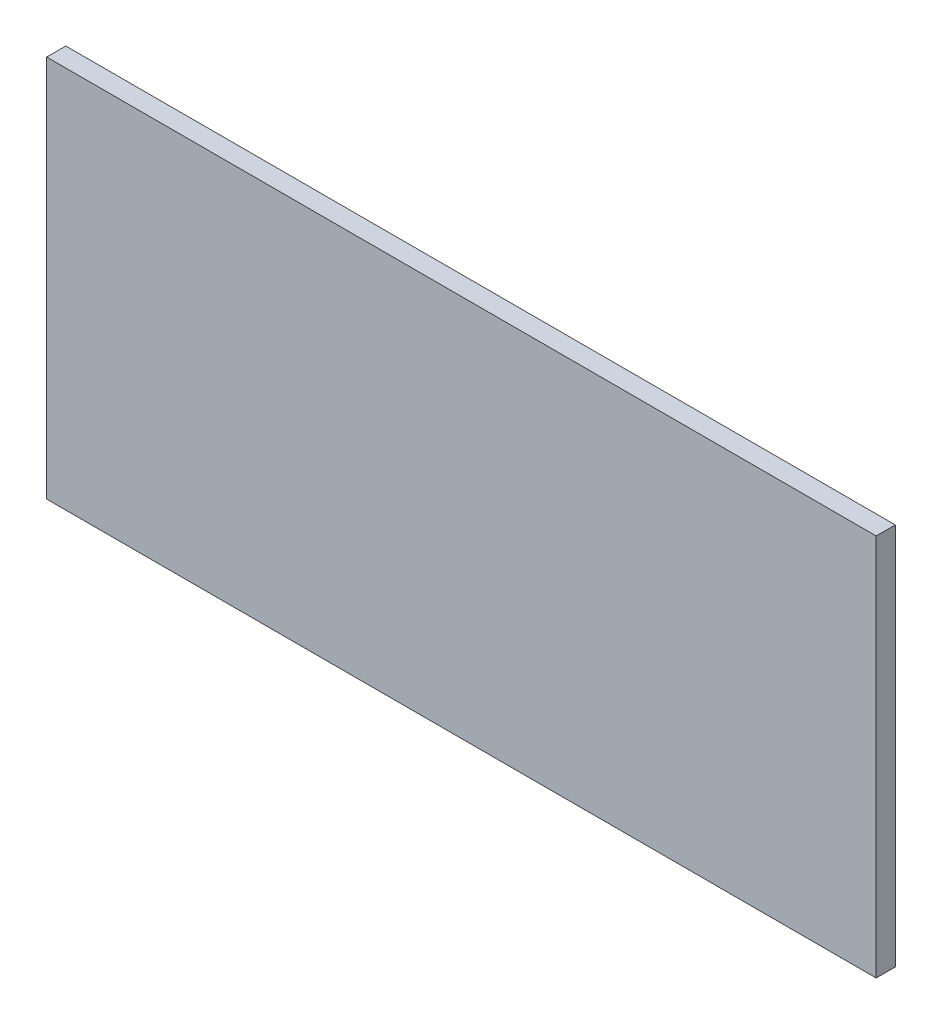
ISO-10303-21;
HEADER;
FILE_DESCRIPTION(('STEP AP214'),'2;1');
FILE_NAME('part.step','',(''),(''),'','','');
FILE_SCHEMA(('AUTOMOTIVE_DESIGN { 1 0 10303 214 1 1 1 1 }'));
ENDSEC;
DATA;
#1=APPLICATION_CONTEXT('core data for automotive mechanical design processes');
#2=APPLICATION_PROTOCOL_DEFINITION('international standard','automotive_design',2000,#1);
#3=PRODUCT_CONTEXT('',#1,'mechanical');
#4=PRODUCT('Part','Part','',(#3));
#5=PRODUCT_RELATED_PRODUCT_CATEGORY('part','',(#4));
#6=PRODUCT_DEFINITION_FORMATION('','',#4);
#7=PRODUCT_DEFINITION_CONTEXT('part definition',#1,'design');
#8=PRODUCT_DEFINITION('design','',#6,#7);
#9=PRODUCT_DEFINITION_SHAPE('','',#8);
#10=(LENGTH_UNIT() NAMED_UNIT(*) SI_UNIT(.MILLI.,.METRE.));
#11=(NAMED_UNIT(*) PLANE_ANGLE_UNIT() SI_UNIT($,.RADIAN.));
#12=(NAMED_UNIT(*) SI_UNIT($,.STERADIAN.) SOLID_ANGLE_UNIT());
#13=UNCERTAINTY_MEASURE_WITH_UNIT(LENGTH_MEASURE(1.E-05),#10,'distance_accuracy_value','');
#14=(GEOMETRIC_REPRESENTATION_CONTEXT(3) GLOBAL_UNCERTAINTY_ASSIGNED_CONTEXT((#13)) GLOBAL_UNIT_ASSIGNED_CONTEXT((#10,
#11,#12)) REPRESENTATION_CONTEXT('',''));
#15=CARTESIAN_POINT('',(0.,0.,0.));
#16=DIRECTION('',(0.,0.,1.));
#17=DIRECTION('',(1.,0.,0.));
#18=AXIS2_PLACEMENT_3D('',#15,#16,#17);
#19=CARTESIAN_POINT('',(120.32,25.3614,-3.));
#20=DIRECTION('',(0.,0.,1.));
#21=DIRECTION('',(1.,0.,0.));
#22=AXIS2_PLACEMENT_3D('',#19,#20,#21);
#23=CYLINDRICAL_SURFACE('',#22,2.49999999999999);
#24=CARTESIAN_POINT('',(120.32,25.3614,-1.5));
#25=DIRECTION('',(0.,0.,-1.));
#26=DIRECTION('',(1.,0.,0.));
#27=AXIS2_PLACEMENT_3D('',#24,#25,#26);
#28=CIRCLE('',#27,2.49999999999999);
#29=CARTESIAN_POINT('',(120.32,27.8614,-1.5));
#30=VERTEX_POINT('',#29);
#31=CARTESIAN_POINT('',(122.82,25.3614,-1.5));
#32=VERTEX_POINT('',#31);
#33=EDGE_CURVE('E141',#30,#32,#28,.T.);
#34=ORIENTED_EDGE('',*,*,#33,.T.);
#35=DIRECTION('',(0.,0.,1.));
#36=VECTOR('',#35,1.);
#37=CARTESIAN_POINT('',(122.82,25.3614,-3.));
#38=LINE('',#37,#36);
#39=CARTESIAN_POINT('',(122.82,25.3614,-3.));
#40=VERTEX_POINT('',#39);
#41=EDGE_CURVE('E12',#40,#32,#38,.T.);
#42=ORIENTED_EDGE('',*,*,#41,.F.);
#43=CARTESIAN_POINT('',(120.32,25.3614,-3.));
#44=DIRECTION('',(0.,0.,-1.));
#45=DIRECTION('',(1.,0.,0.));
#46=AXIS2_PLACEMENT_3D('',#43,#44,#45);
#47=CIRCLE('',#46,2.49999999999999);
#48=CARTESIAN_POINT('',(120.32,27.8614,-3.));
#49=VERTEX_POINT('',#48);
#50=EDGE_CURVE('E155',#49,#40,#47,.T.);
#51=ORIENTED_EDGE('',*,*,#50,.F.);
#52=DIRECTION('',(0.,0.,1.));
#53=VECTOR('',#52,1.);
#54=CARTESIAN_POINT('',(120.32,27.8614,-3.));
#55=LINE('',#54,#53);
#56=EDGE_CURVE('E137',#49,#30,#55,.T.);
#57=ORIENTED_EDGE('',*,*,#56,.T.);
#58=EDGE_LOOP('',(#34,#42,#51,#57));
#59=FACE_BOUND('',#58,.T.);
#60=ADVANCED_FACE('F45',(#59),#23,.T.);
#61=CARTESIAN_POINT('',(122.82,11.3614,-3.));
#62=DIRECTION('',(-1.,0.,0.));
#63=DIRECTION('',(0.,0.,1.));
#64=AXIS2_PLACEMENT_3D('',#61,#62,#63);
#65=PLANE('',#64);
#66=DIRECTION('',(0.,-1.,0.));
#67=VECTOR('',#66,1.);
#68=CARTESIAN_POINT('',(122.82,11.3614,-1.5));
#69=LINE('',#68,#67);
#70=CARTESIAN_POINT('',(122.82,11.3614,-1.5));
#71=VERTEX_POINT('',#70);
#72=EDGE_CURVE('E144',#32,#71,#69,.T.);
#73=ORIENTED_EDGE('',*,*,#72,.T.);
#74=DIRECTION('',(0.,0.,1.));
#75=VECTOR('',#74,1.);
#76=CARTESIAN_POINT('',(122.82,11.3614,-3.));
#77=LINE('',#76,#75);
#78=CARTESIAN_POINT('',(122.82,11.3614,-3.));
#79=VERTEX_POINT('',#78);
#80=EDGE_CURVE('E53',#79,#71,#77,.T.);
#81=ORIENTED_EDGE('',*,*,#80,.F.);
#82=DIRECTION('',(0.,-1.,0.));
#83=VECTOR('',#82,1.);
#84=CARTESIAN_POINT('',(122.82,11.3614,-3.));
#85=LINE('',#84,#83);
#86=EDGE_CURVE('E104',#40,#79,#85,.T.);
#87=ORIENTED_EDGE('',*,*,#86,.F.);
#88=ORIENTED_EDGE('',*,*,#41,.T.);
#89=EDGE_LOOP('',(#73,#81,#87,#88));
#90=FACE_BOUND('',#89,.T.);
#91=ADVANCED_FACE('F190',(#90),#65,.F.);
#92=CARTESIAN_POINT('',(120.32,11.3614,-3.));
#93=DIRECTION('',(0.,0.,1.));
#94=DIRECTION('',(1.,0.,0.));
#95=AXIS2_PLACEMENT_3D('',#92,#93,#94);
#96=CYLINDRICAL_SURFACE('',#95,2.49999999999999);
#97=CARTESIAN_POINT('',(120.32,11.3614,-1.5));
#98=DIRECTION('',(0.,0.,-1.));
#99=DIRECTION('',(1.,0.,0.));
#100=AXIS2_PLACEMENT_3D('',#97,#98,#99);
#101=CIRCLE('',#100,2.49999999999999);
#102=CARTESIAN_POINT('',(120.32,8.86139999999998,-1.5));
#103=VERTEX_POINT('',#102);
#104=EDGE_CURVE('E146',#71,#103,#101,.T.);
#105=ORIENTED_EDGE('',*,*,#104,.T.);
#106=DIRECTION('',(0.,0.,1.));
#107=VECTOR('',#106,1.);
#108=CARTESIAN_POINT('',(120.32,8.86139999999998,-3.));
#109=LINE('',#108,#107);
#110=CARTESIAN_POINT('',(120.32,8.86139999999998,-3.));
#111=VERTEX_POINT('',#110);
#112=EDGE_CURVE('E162',#111,#103,#109,.T.);
#113=ORIENTED_EDGE('',*,*,#112,.F.);
#114=CARTESIAN_POINT('',(120.32,11.3614,-3.));
#115=DIRECTION('',(0.,0.,-1.));
#116=DIRECTION('',(1.,0.,0.));
#117=AXIS2_PLACEMENT_3D('',#114,#115,#116);
#118=CIRCLE('',#117,2.49999999999999);
#119=EDGE_CURVE('E170',#79,#111,#118,.T.);
#120=ORIENTED_EDGE('',*,*,#119,.F.);
#121=ORIENTED_EDGE('',*,*,#80,.T.);
#122=EDGE_LOOP('',(#105,#113,#120,#121));
#123=FACE_BOUND('',#122,.T.);
#124=ADVANCED_FACE('F168',(#123),#96,.T.);
#125=CARTESIAN_POINT('',(75.3200000000001,8.86139999999997,-3.));
#126=DIRECTION('',(0.,1.,0.));
#127=DIRECTION('',(0.,0.,1.));
#128=AXIS2_PLACEMENT_3D('',#125,#126,#127);
#129=PLANE('',#128);
#130=DIRECTION('',(-1.,0.,0.));
#131=VECTOR('',#130,1.);
#132=CARTESIAN_POINT('',(75.3200000000001,8.86139999999997,-1.5));
#133=LINE('',#132,#131);
#134=CARTESIAN_POINT('',(75.3200000000001,8.86139999999997,-1.5));
#135=VERTEX_POINT('',#134);
#136=EDGE_CURVE('E148',#103,#135,#133,.T.);
#137=ORIENTED_EDGE('',*,*,#136,.T.);
#138=DIRECTION('',(0.,0.,1.));
#139=VECTOR('',#138,1.);
#140=CARTESIAN_POINT('',(75.3200000000001,8.86139999999997,-3.));
#141=LINE('',#140,#139);
#142=CARTESIAN_POINT('',(75.3200000000001,8.86139999999997,-3.));
#143=VERTEX_POINT('',#142);
#144=EDGE_CURVE('E159',#143,#135,#141,.T.);
#145=ORIENTED_EDGE('',*,*,#144,.F.);
#146=DIRECTION('',(-1.,0.,0.));
#147=VECTOR('',#146,1.);
#148=CARTESIAN_POINT('',(75.3200000000001,8.86139999999997,-3.));
#149=LINE('',#148,#147);
#150=EDGE_CURVE('E182',#111,#143,#149,.T.);
#151=ORIENTED_EDGE('',*,*,#150,.F.);
#152=ORIENTED_EDGE('',*,*,#112,.T.);
#153=EDGE_LOOP('',(#137,#145,#151,#152));
#154=FACE_BOUND('',#153,.T.);
#155=ADVANCED_FACE('F178',(#154),#129,.F.);
#156=CARTESIAN_POINT('',(75.3200000000001,11.3614,-3.));
#157=DIRECTION('',(0.,0.,1.));
#158=DIRECTION('',(1.,0.,0.));
#159=AXIS2_PLACEMENT_3D('',#156,#157,#158);
#160=CYLINDRICAL_SURFACE('',#159,2.5);
#161=CARTESIAN_POINT('',(75.3200000000001,11.3614,-1.5));
#162=DIRECTION('',(0.,0.,-1.));
#163=DIRECTION('',(-1.,0.,0.));
#164=AXIS2_PLACEMENT_3D('',#161,#162,#163);
#165=CIRCLE('',#164,2.5);
#166=CARTESIAN_POINT('',(72.8200000000001,11.3614,-1.5));
#167=VERTEX_POINT('',#166);
#168=EDGE_CURVE('E150',#135,#167,#165,.T.);
#169=ORIENTED_EDGE('',*,*,#168,.T.);
#170=DIRECTION('',(0.,0.,1.));
#171=VECTOR('',#170,1.);
#172=CARTESIAN_POINT('',(72.8200000000001,11.3614,-3.));
#173=LINE('',#172,#171);
#174=CARTESIAN_POINT('',(72.8200000000001,11.3614,-3.));
#175=VERTEX_POINT('',#174);
#176=EDGE_CURVE('E132',#175,#167,#173,.T.);
#177=ORIENTED_EDGE('',*,*,#176,.F.);
#178=CARTESIAN_POINT('',(75.3200000000001,11.3614,-3.));
#179=DIRECTION('',(0.,0.,-1.));
#180=DIRECTION('',(-1.,0.,0.));
#181=AXIS2_PLACEMENT_3D('',#178,#179,#180);
#182=CIRCLE('',#181,2.5);
#183=EDGE_CURVE('E123',#143,#175,#182,.T.);
#184=ORIENTED_EDGE('',*,*,#183,.F.);
#185=ORIENTED_EDGE('',*,*,#144,.T.);
#186=EDGE_LOOP('',(#169,#177,#184,#185));
#187=FACE_BOUND('',#186,.T.);
#188=ADVANCED_FACE('F181',(#187),#160,.T.);
#189=CARTESIAN_POINT('',(72.8200000000001,25.3614,-3.));
#190=DIRECTION('',(1.,0.,0.));
#191=DIRECTION('',(0.,0.,-1.));
#192=AXIS2_PLACEMENT_3D('',#189,#190,#191);
#193=PLANE('',#192);
#194=DIRECTION('',(0.,1.,0.));
#195=VECTOR('',#194,1.);
#196=CARTESIAN_POINT('',(72.8200000000001,25.3614,-1.5));
#197=LINE('',#196,#195);
#198=CARTESIAN_POINT('',(72.8200000000001,25.3614,-1.5));
#199=VERTEX_POINT('',#198);
#200=EDGE_CURVE('E131',#167,#199,#197,.T.);
#201=ORIENTED_EDGE('',*,*,#200,.T.);
#202=DIRECTION('',(0.,0.,1.));
#203=VECTOR('',#202,1.);
#204=CARTESIAN_POINT('',(72.8200000000001,25.3614,-3.));
#205=LINE('',#204,#203);
#206=CARTESIAN_POINT('',(72.8200000000001,25.3614,-3.));
#207=VERTEX_POINT('',#206);
#208=EDGE_CURVE('E128',#207,#199,#205,.T.);
#209=ORIENTED_EDGE('',*,*,#208,.F.);
#210=DIRECTION('',(0.,1.,0.));
#211=VECTOR('',#210,1.);
#212=CARTESIAN_POINT('',(72.8200000000001,25.3614,-3.));
#213=LINE('',#212,#211);
#214=EDGE_CURVE('E117',#175,#207,#213,.T.);
#215=ORIENTED_EDGE('',*,*,#214,.F.);
#216=ORIENTED_EDGE('',*,*,#176,.T.);
#217=EDGE_LOOP('',(#201,#209,#215,#216));
#218=FACE_BOUND('',#217,.T.);
#219=ADVANCED_FACE('F129',(#218),#193,.F.);
#220=CARTESIAN_POINT('',(75.3200000000001,25.3614,-3.));
#221=DIRECTION('',(0.,0.,1.));
#222=DIRECTION('',(1.,0.,0.));
#223=AXIS2_PLACEMENT_3D('',#220,#221,#222);
#224=CYLINDRICAL_SURFACE('',#223,2.5);
#225=CARTESIAN_POINT('',(75.3200000000001,25.3614,-1.5));
#226=DIRECTION('',(0.,0.,-1.));
#227=DIRECTION('',(1.,0.,0.));
#228=AXIS2_PLACEMENT_3D('',#225,#226,#227);
#229=CIRCLE('',#228,2.5);
#230=CARTESIAN_POINT('',(75.3200000000001,27.8614,-1.5));
#231=VERTEX_POINT('',#230);
#232=EDGE_CURVE('E90',#199,#231,#229,.T.);
#233=ORIENTED_EDGE('',*,*,#232,.T.);
#234=DIRECTION('',(0.,0.,1.));
#235=VECTOR('',#234,1.);
#236=CARTESIAN_POINT('',(75.3200000000001,27.8614,-3.));
#237=LINE('',#236,#235);
#238=CARTESIAN_POINT('',(75.3200000000001,27.8614,-3.));
#239=VERTEX_POINT('',#238);
#240=EDGE_CURVE('E133',#239,#231,#237,.T.);
#241=ORIENTED_EDGE('',*,*,#240,.F.);
#242=CARTESIAN_POINT('',(75.3200000000001,25.3614,-3.));
#243=DIRECTION('',(0.,0.,-1.));
#244=DIRECTION('',(1.,0.,0.));
#245=AXIS2_PLACEMENT_3D('',#242,#243,#244);
#246=CIRCLE('',#245,2.5);
#247=EDGE_CURVE('E121',#207,#239,#246,.T.);
#248=ORIENTED_EDGE('',*,*,#247,.F.);
#249=ORIENTED_EDGE('',*,*,#208,.T.);
#250=EDGE_LOOP('',(#233,#241,#248,#249));
#251=FACE_BOUND('',#250,.T.);
#252=ADVANCED_FACE('F135',(#251),#224,.T.);
#253=CARTESIAN_POINT('',(120.32,27.8614,-3.));
#254=DIRECTION('',(0.,-1.,0.));
#255=DIRECTION('',(0.,0.,-1.));
#256=AXIS2_PLACEMENT_3D('',#253,#254,#255);
#257=PLANE('',#256);
#258=DIRECTION('',(1.,0.,0.));
#259=VECTOR('',#258,1.);
#260=CARTESIAN_POINT('',(120.32,27.8614,-1.5));
#261=LINE('',#260,#259);
#262=EDGE_CURVE('E96',#231,#30,#261,.T.);
#263=ORIENTED_EDGE('',*,*,#262,.T.);
#264=ORIENTED_EDGE('',*,*,#56,.F.);
#265=DIRECTION('',(1.,0.,0.));
#266=VECTOR('',#265,1.);
#267=CARTESIAN_POINT('',(120.32,27.8614,-3.));
#268=LINE('',#267,#266);
#269=EDGE_CURVE('E61',#239,#49,#268,.T.);
#270=ORIENTED_EDGE('',*,*,#269,.F.);
#271=ORIENTED_EDGE('',*,*,#240,.T.);
#272=EDGE_LOOP('',(#263,#264,#270,#271));
#273=FACE_BOUND('',#272,.T.);
#274=ADVANCED_FACE('F206',(#273),#257,.F.);
#275=CARTESIAN_POINT('',(120.32,25.3614,-3.));
#276=DIRECTION('',(0.,0.,1.));
#277=DIRECTION('',(1.,0.,0.));
#278=AXIS2_PLACEMENT_3D('',#275,#276,#277);
#279=PLANE('',#278);
#280=ORIENTED_EDGE('',*,*,#50,.T.);
#281=ORIENTED_EDGE('',*,*,#86,.T.);
#282=ORIENTED_EDGE('',*,*,#119,.T.);
#283=ORIENTED_EDGE('',*,*,#150,.T.);
#284=ORIENTED_EDGE('',*,*,#183,.T.);
#285=ORIENTED_EDGE('',*,*,#214,.T.);
#286=ORIENTED_EDGE('',*,*,#247,.T.);
#287=ORIENTED_EDGE('',*,*,#269,.T.);
#288=EDGE_LOOP('',(#280,#281,#282,#283,#284,#285,#286,#287));
#289=FACE_BOUND('',#288,.T.);
#290=ADVANCED_FACE('F119',(#289),#279,.F.);
#291=CARTESIAN_POINT('',(120.32,25.3614,-1.5));
#292=DIRECTION('',(0.,0.,1.));
#293=DIRECTION('',(1.,0.,0.));
#294=AXIS2_PLACEMENT_3D('',#291,#292,#293);
#295=PLANE('',#294);
#296=ORIENTED_EDGE('',*,*,#33,.F.);
#297=ORIENTED_EDGE('',*,*,#262,.F.);
#298=ORIENTED_EDGE('',*,*,#232,.F.);
#299=ORIENTED_EDGE('',*,*,#200,.F.);
#300=ORIENTED_EDGE('',*,*,#168,.F.);
#301=ORIENTED_EDGE('',*,*,#136,.F.);
#302=ORIENTED_EDGE('',*,*,#104,.F.);
#303=ORIENTED_EDGE('',*,*,#72,.F.);
#304=EDGE_LOOP('',(#296,#297,#298,#299,#300,#301,#302,#303));
#305=FACE_BOUND('',#304,.T.);
#306=ADVANCED_FACE('F174',(#305),#295,.T.);
#307=CLOSED_SHELL('',(#60,#91,#124,#155,#188,#219,#252,#274,#290,#306));
#308=MANIFOLD_SOLID_BREP('B2',#307);
#309=CARTESIAN_POINT('',(130.32,3.36139999999998,-1.5));
#310=DIRECTION('',(0.,-1.,0.));
#311=DIRECTION('',(1.,0.,0.));
#312=AXIS2_PLACEMENT_3D('',#309,#310,#311);
#313=PLANE('',#312);
#314=DIRECTION('',(1.,0.,0.));
#315=VECTOR('',#314,1.);
#316=CARTESIAN_POINT('',(130.32,3.36139999999998,0.));
#317=LINE('',#316,#315);
#318=CARTESIAN_POINT('',(65.3200000000001,3.36139999999997,0.));
#319=VERTEX_POINT('',#318);
#320=CARTESIAN_POINT('',(130.32,3.36139999999998,0.));
#321=VERTEX_POINT('',#320);
#322=EDGE_CURVE('E337',#319,#321,#317,.T.);
#323=ORIENTED_EDGE('',*,*,#322,.F.);
#324=DIRECTION('',(0.,0.,1.));
#325=VECTOR('',#324,1.);
#326=CARTESIAN_POINT('',(65.3200000000001,3.36139999999997,-1.5));
#327=LINE('',#326,#325);
#328=CARTESIAN_POINT('',(65.3200000000001,3.36139999999997,-1.5));
#329=VERTEX_POINT('',#328);
#330=EDGE_CURVE('E43',#329,#319,#327,.T.);
#331=ORIENTED_EDGE('',*,*,#330,.F.);
#332=DIRECTION('',(1.,0.,0.));
#333=VECTOR('',#332,1.);
#334=CARTESIAN_POINT('',(130.32,3.36139999999998,-1.5));
#335=LINE('',#334,#333);
#336=CARTESIAN_POINT('',(130.32,3.36139999999998,-1.5));
#337=VERTEX_POINT('',#336);
#338=EDGE_CURVE('E331',#329,#337,#335,.T.);
#339=ORIENTED_EDGE('',*,*,#338,.T.);
#340=DIRECTION('',(0.,0.,1.));
#341=VECTOR('',#340,1.);
#342=CARTESIAN_POINT('',(130.32,3.36139999999998,-1.5));
#343=LINE('',#342,#341);
#344=EDGE_CURVE('E276',#337,#321,#343,.T.);
#345=ORIENTED_EDGE('',*,*,#344,.T.);
#346=EDGE_LOOP('',(#323,#331,#339,#345));
#347=FACE_BOUND('',#346,.T.);
#348=ADVANCED_FACE('F273',(#347),#313,.T.);
#349=CARTESIAN_POINT('',(65.3200000000001,3.36139999999997,-1.5));
#350=DIRECTION('',(-1.,0.,0.));
#351=DIRECTION('',(0.,0.,1.));
#352=AXIS2_PLACEMENT_3D('',#349,#350,#351);
#353=PLANE('',#352);
#354=DIRECTION('',(0.,-1.,0.));
#355=VECTOR('',#354,1.);
#356=CARTESIAN_POINT('',(65.3200000000001,3.36139999999997,0.));
#357=LINE('',#356,#355);
#358=CARTESIAN_POINT('',(65.3200000000001,33.3614,0.));
#359=VERTEX_POINT('',#358);
#360=EDGE_CURVE('E333',#359,#319,#357,.T.);
#361=ORIENTED_EDGE('',*,*,#360,.F.);
#362=DIRECTION('',(0.,0.,1.));
#363=VECTOR('',#362,1.);
#364=CARTESIAN_POINT('',(65.3200000000001,33.3614,-1.5));
#365=LINE('',#364,#363);
#366=CARTESIAN_POINT('',(65.3200000000001,33.3614,-1.5));
#367=VERTEX_POINT('',#366);
#368=EDGE_CURVE('E282',#367,#359,#365,.T.);
#369=ORIENTED_EDGE('',*,*,#368,.F.);
#370=DIRECTION('',(0.,-1.,0.));
#371=VECTOR('',#370,1.);
#372=CARTESIAN_POINT('',(65.3200000000001,3.36139999999997,-1.5));
#373=LINE('',#372,#371);
#374=EDGE_CURVE('E328',#367,#329,#373,.T.);
#375=ORIENTED_EDGE('',*,*,#374,.T.);
#376=ORIENTED_EDGE('',*,*,#330,.T.);
#377=EDGE_LOOP('',(#361,#369,#375,#376));
#378=FACE_BOUND('',#377,.T.);
#379=ADVANCED_FACE('F347',(#378),#353,.T.);
#380=CARTESIAN_POINT('',(65.3200000000001,33.3614,-1.5));
#381=DIRECTION('',(0.,1.,0.));
#382=DIRECTION('',(0.,0.,1.));
#383=AXIS2_PLACEMENT_3D('',#380,#381,#382);
#384=PLANE('',#383);
#385=DIRECTION('',(-1.,0.,0.));
#386=VECTOR('',#385,1.);
#387=CARTESIAN_POINT('',(65.3200000000001,33.3614,0.));
#388=LINE('',#387,#386);
#389=CARTESIAN_POINT('',(130.32,33.3614,0.));
#390=VERTEX_POINT('',#389);
#391=EDGE_CURVE('E323',#390,#359,#388,.T.);
#392=ORIENTED_EDGE('',*,*,#391,.F.);
#393=DIRECTION('',(0.,0.,1.));
#394=VECTOR('',#393,1.);
#395=CARTESIAN_POINT('',(130.32,33.3614,-1.5));
#396=LINE('',#395,#394);
#397=CARTESIAN_POINT('',(130.32,33.3614,-1.5));
#398=VERTEX_POINT('',#397);
#399=EDGE_CURVE('E318',#398,#390,#396,.T.);
#400=ORIENTED_EDGE('',*,*,#399,.F.);
#401=DIRECTION('',(-1.,0.,0.));
#402=VECTOR('',#401,1.);
#403=CARTESIAN_POINT('',(65.3200000000001,33.3614,-1.5));
#404=LINE('',#403,#402);
#405=EDGE_CURVE('E321',#398,#367,#404,.T.);
#406=ORIENTED_EDGE('',*,*,#405,.T.);
#407=ORIENTED_EDGE('',*,*,#368,.T.);
#408=EDGE_LOOP('',(#392,#400,#406,#407));
#409=FACE_BOUND('',#408,.T.);
#410=ADVANCED_FACE('F320',(#409),#384,.T.);
#411=CARTESIAN_POINT('',(130.32,33.3614,-1.5));
#412=DIRECTION('',(1.,0.,0.));
#413=DIRECTION('',(0.,0.,-1.));
#414=AXIS2_PLACEMENT_3D('',#411,#412,#413);
#415=PLANE('',#414);
#416=DIRECTION('',(0.,1.,0.));
#417=VECTOR('',#416,1.);
#418=CARTESIAN_POINT('',(130.32,33.3614,0.));
#419=LINE('',#418,#417);
#420=EDGE_CURVE('E340',#321,#390,#419,.T.);
#421=ORIENTED_EDGE('',*,*,#420,.F.);
#422=ORIENTED_EDGE('',*,*,#344,.F.);
#423=DIRECTION('',(0.,1.,0.));
#424=VECTOR('',#423,1.);
#425=CARTESIAN_POINT('',(130.32,33.3614,-1.5));
#426=LINE('',#425,#424);
#427=EDGE_CURVE('E327',#337,#398,#426,.T.);
#428=ORIENTED_EDGE('',*,*,#427,.T.);
#429=ORIENTED_EDGE('',*,*,#399,.T.);
#430=EDGE_LOOP('',(#421,#422,#428,#429));
#431=FACE_BOUND('',#430,.T.);
#432=ADVANCED_FACE('F330',(#431),#415,.T.);
#433=CARTESIAN_POINT('',(0.,0.,-1.5));
#434=DIRECTION('',(0.,0.,-1.));
#435=DIRECTION('',(-1.,0.,0.));
#436=AXIS2_PLACEMENT_3D('',#433,#434,#435);
#437=PLANE('',#436);
#438=ORIENTED_EDGE('',*,*,#338,.F.);
#439=ORIENTED_EDGE('',*,*,#374,.F.);
#440=ORIENTED_EDGE('',*,*,#405,.F.);
#441=ORIENTED_EDGE('',*,*,#427,.F.);
#442=EDGE_LOOP('',(#438,#439,#440,#441));
#443=FACE_BOUND('',#442,.T.);
#444=ADVANCED_FACE('F326',(#443),#437,.T.);
#445=CARTESIAN_POINT('',(0.,0.,0.));
#446=DIRECTION('',(0.,0.,-1.));
#447=DIRECTION('',(-1.,0.,0.));
#448=AXIS2_PLACEMENT_3D('',#445,#446,#447);
#449=PLANE('',#448);
#450=ORIENTED_EDGE('',*,*,#322,.T.);
#451=ORIENTED_EDGE('',*,*,#420,.T.);
#452=ORIENTED_EDGE('',*,*,#391,.T.);
#453=ORIENTED_EDGE('',*,*,#360,.T.);
#454=EDGE_LOOP('',(#450,#451,#452,#453));
#455=FACE_BOUND('',#454,.T.);
#456=ADVANCED_FACE('F346',(#455),#449,.F.);
#457=CLOSED_SHELL('',(#348,#379,#410,#432,#444,#456));
#458=MANIFOLD_SOLID_BREP('B6',#457);
#459=ADVANCED_BREP_SHAPE_REPRESENTATION('',(#18,#308,#458),#14);
#460=SHAPE_DEFINITION_REPRESENTATION(#9,#459);
ENDSEC;
END-ISO-10303-21;
